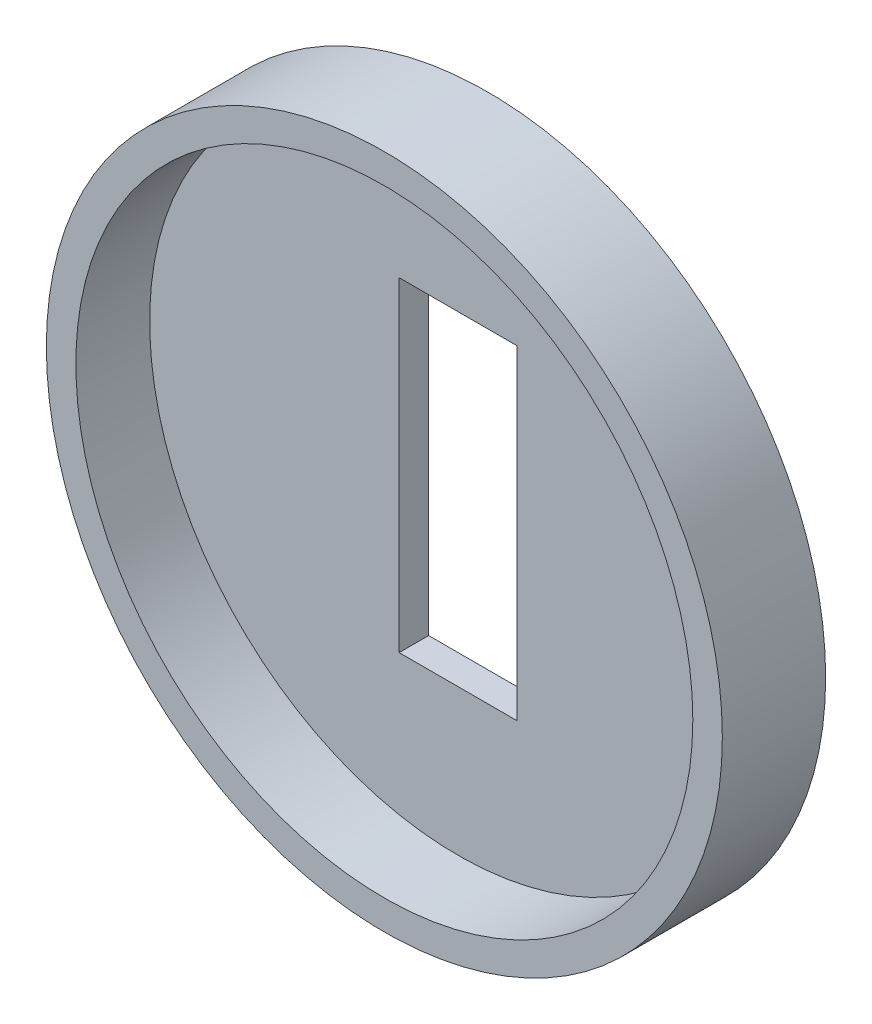
ISO-10303-21;
HEADER;
FILE_DESCRIPTION(('STEP AP214'),'2;1');
FILE_NAME('part.step','',(''),(''),'','','');
FILE_SCHEMA(('AUTOMOTIVE_DESIGN { 1 0 10303 214 1 1 1 1 }'));
ENDSEC;
DATA;
#1=APPLICATION_CONTEXT('core data for automotive mechanical design processes');
#2=APPLICATION_PROTOCOL_DEFINITION('international standard','automotive_design',2000,#1);
#3=PRODUCT_CONTEXT('',#1,'mechanical');
#4=PRODUCT('Part','Part','',(#3));
#5=PRODUCT_RELATED_PRODUCT_CATEGORY('part','',(#4));
#6=PRODUCT_DEFINITION_FORMATION('','',#4);
#7=PRODUCT_DEFINITION_CONTEXT('part definition',#1,'design');
#8=PRODUCT_DEFINITION('design','',#6,#7);
#9=PRODUCT_DEFINITION_SHAPE('','',#8);
#10=(LENGTH_UNIT() NAMED_UNIT(*) SI_UNIT(.MILLI.,.METRE.));
#11=(NAMED_UNIT(*) PLANE_ANGLE_UNIT() SI_UNIT($,.RADIAN.));
#12=(NAMED_UNIT(*) SI_UNIT($,.STERADIAN.) SOLID_ANGLE_UNIT());
#13=UNCERTAINTY_MEASURE_WITH_UNIT(LENGTH_MEASURE(1.E-05),#10,'distance_accuracy_value','');
#14=(GEOMETRIC_REPRESENTATION_CONTEXT(3) GLOBAL_UNCERTAINTY_ASSIGNED_CONTEXT((#13)) GLOBAL_UNIT_ASSIGNED_CONTEXT((#10,
#11,#12)) REPRESENTATION_CONTEXT('',''));
#15=CARTESIAN_POINT('',(0.,0.,0.));
#16=DIRECTION('',(0.,0.,1.));
#17=DIRECTION('',(1.,0.,0.));
#18=AXIS2_PLACEMENT_3D('',#15,#16,#17);
#19=CARTESIAN_POINT('',(0.,0.,0.));
#20=DIRECTION('',(0.,0.,-1.));
#21=DIRECTION('',(-1.,0.,0.));
#22=AXIS2_PLACEMENT_3D('',#19,#20,#21);
#23=PLANE('',#22);
#24=CARTESIAN_POINT('',(0.,0.,0.));
#25=DIRECTION('',(0.,0.,1.));
#26=DIRECTION('',(1.,0.,0.));
#27=AXIS2_PLACEMENT_3D('',#24,#25,#26);
#28=CIRCLE('',#27,22.902);
#29=CARTESIAN_POINT('',(22.902,0.,0.));
#30=VERTEX_POINT('',#29);
#31=EDGE_CURVE('E124',#30,#30,#28,.T.);
#32=ORIENTED_EDGE('',*,*,#31,.F.);
#33=EDGE_LOOP('',(#32));
#34=FACE_BOUND('',#33,.T.);
#35=DIRECTION('',(1.,0.,0.));
#36=VECTOR('',#35,1.);
#37=CARTESIAN_POINT('',(0.,11.,0.));
#38=LINE('',#37,#36);
#39=CARTESIAN_POINT('',(-4.,11.,0.));
#40=VERTEX_POINT('',#39);
#41=CARTESIAN_POINT('',(4.,11.,0.));
#42=VERTEX_POINT('',#41);
#43=EDGE_CURVE('E92',#40,#42,#38,.T.);
#44=ORIENTED_EDGE('',*,*,#43,.F.);
#45=DIRECTION('',(0.,-1.,0.));
#46=VECTOR('',#45,1.);
#47=CARTESIAN_POINT('',(-4.,0.,0.));
#48=LINE('',#47,#46);
#49=CARTESIAN_POINT('',(-4.,-11.,0.));
#50=VERTEX_POINT('',#49);
#51=EDGE_CURVE('E53',#40,#50,#48,.T.);
#52=ORIENTED_EDGE('',*,*,#51,.T.);
#53=DIRECTION('',(1.,0.,0.));
#54=VECTOR('',#53,1.);
#55=CARTESIAN_POINT('',(0.,-11.,0.));
#56=LINE('',#55,#54);
#57=CARTESIAN_POINT('',(4.,-11.,0.));
#58=VERTEX_POINT('',#57);
#59=EDGE_CURVE('E98',#50,#58,#56,.T.);
#60=ORIENTED_EDGE('',*,*,#59,.T.);
#61=DIRECTION('',(0.,-1.,0.));
#62=VECTOR('',#61,1.);
#63=CARTESIAN_POINT('',(4.,0.,0.));
#64=LINE('',#63,#62);
#65=EDGE_CURVE('E82',#42,#58,#64,.T.);
#66=ORIENTED_EDGE('',*,*,#65,.F.);
#67=EDGE_LOOP('',(#44,#52,#60,#66));
#68=FACE_BOUND('',#67,.T.);
#69=ADVANCED_FACE('F38',(#34,#68),#23,.T.);
#70=CARTESIAN_POINT('',(20.902,0.,2.));
#71=DIRECTION('',(0.,0.,1.));
#72=DIRECTION('',(1.,0.,0.));
#73=AXIS2_PLACEMENT_3D('',#70,#71,#72);
#74=PLANE('',#73);
#75=CARTESIAN_POINT('',(0.,0.,2.));
#76=DIRECTION('',(0.,0.,1.));
#77=DIRECTION('',(1.,0.,0.));
#78=AXIS2_PLACEMENT_3D('',#75,#76,#77);
#79=CIRCLE('',#78,20.902);
#80=CARTESIAN_POINT('',(20.902,0.,2.));
#81=VERTEX_POINT('',#80);
#82=EDGE_CURVE('E108',#81,#81,#79,.T.);
#83=ORIENTED_EDGE('',*,*,#82,.T.);
#84=EDGE_LOOP('',(#83));
#85=FACE_BOUND('',#84,.T.);
#86=DIRECTION('',(-1.,0.,0.));
#87=VECTOR('',#86,1.);
#88=CARTESIAN_POINT('',(20.902,-11.,2.));
#89=LINE('',#88,#87);
#90=CARTESIAN_POINT('',(4.,-11.,2.));
#91=VERTEX_POINT('',#90);
#92=CARTESIAN_POINT('',(-4.,-11.,2.));
#93=VERTEX_POINT('',#92);
#94=EDGE_CURVE('E46',#91,#93,#89,.T.);
#95=ORIENTED_EDGE('',*,*,#94,.T.);
#96=DIRECTION('',(0.,1.,0.));
#97=VECTOR('',#96,1.);
#98=CARTESIAN_POINT('',(-4.,0.,2.));
#99=LINE('',#98,#97);
#100=CARTESIAN_POINT('',(-4.,11.,2.));
#101=VERTEX_POINT('',#100);
#102=EDGE_CURVE('E11',#93,#101,#99,.T.);
#103=ORIENTED_EDGE('',*,*,#102,.T.);
#104=DIRECTION('',(-1.,0.,0.));
#105=VECTOR('',#104,1.);
#106=CARTESIAN_POINT('',(20.902,11.,2.));
#107=LINE('',#106,#105);
#108=CARTESIAN_POINT('',(4.,11.,2.));
#109=VERTEX_POINT('',#108);
#110=EDGE_CURVE('E128',#109,#101,#107,.T.);
#111=ORIENTED_EDGE('',*,*,#110,.F.);
#112=DIRECTION('',(0.,1.,0.));
#113=VECTOR('',#112,1.);
#114=CARTESIAN_POINT('',(4.,0.,2.));
#115=LINE('',#114,#113);
#116=EDGE_CURVE('E85',#91,#109,#115,.T.);
#117=ORIENTED_EDGE('',*,*,#116,.F.);
#118=EDGE_LOOP('',(#95,#103,#111,#117));
#119=FACE_BOUND('',#118,.T.);
#120=ADVANCED_FACE('F135',(#85,#119),#74,.T.);
#121=CARTESIAN_POINT('',(0.,0.,2.));
#122=DIRECTION('',(0.,0.,1.));
#123=DIRECTION('',(1.,0.,0.));
#124=AXIS2_PLACEMENT_3D('',#121,#122,#123);
#125=CYLINDRICAL_SURFACE('',#124,22.902);
#126=ORIENTED_EDGE('',*,*,#31,.T.);
#127=EDGE_LOOP('',(#126));
#128=FACE_BOUND('',#127,.T.);
#129=CARTESIAN_POINT('',(0.,0.,7.));
#130=DIRECTION('',(0.,0.,1.));
#131=DIRECTION('',(1.,0.,0.));
#132=AXIS2_PLACEMENT_3D('',#129,#130,#131);
#133=CIRCLE('',#132,22.902);
#134=CARTESIAN_POINT('',(22.902,0.,7.));
#135=VERTEX_POINT('',#134);
#136=EDGE_CURVE('E120',#135,#135,#133,.T.);
#137=ORIENTED_EDGE('',*,*,#136,.F.);
#138=EDGE_LOOP('',(#137));
#139=FACE_BOUND('',#138,.T.);
#140=ADVANCED_FACE('F160',(#128,#139),#125,.T.);
#141=CARTESIAN_POINT('',(22.902,0.,7.));
#142=DIRECTION('',(0.,0.,1.));
#143=DIRECTION('',(1.,0.,0.));
#144=AXIS2_PLACEMENT_3D('',#141,#142,#143);
#145=PLANE('',#144);
#146=ORIENTED_EDGE('',*,*,#136,.T.);
#147=EDGE_LOOP('',(#146));
#148=FACE_BOUND('',#147,.T.);
#149=CARTESIAN_POINT('',(0.,0.,7.));
#150=DIRECTION('',(0.,0.,1.));
#151=DIRECTION('',(1.,0.,0.));
#152=AXIS2_PLACEMENT_3D('',#149,#150,#151);
#153=CIRCLE('',#152,20.902);
#154=CARTESIAN_POINT('',(20.902,0.,7.));
#155=VERTEX_POINT('',#154);
#156=EDGE_CURVE('E116',#155,#155,#153,.T.);
#157=ORIENTED_EDGE('',*,*,#156,.F.);
#158=EDGE_LOOP('',(#157));
#159=FACE_BOUND('',#158,.T.);
#160=ADVANCED_FACE('F149',(#148,#159),#145,.T.);
#161=CARTESIAN_POINT('',(0.,0.,2.));
#162=DIRECTION('',(0.,0.,1.));
#163=DIRECTION('',(1.,0.,0.));
#164=AXIS2_PLACEMENT_3D('',#161,#162,#163);
#165=CYLINDRICAL_SURFACE('',#164,20.902);
#166=ORIENTED_EDGE('',*,*,#156,.T.);
#167=EDGE_LOOP('',(#166));
#168=FACE_BOUND('',#167,.T.);
#169=ORIENTED_EDGE('',*,*,#82,.F.);
#170=EDGE_LOOP('',(#169));
#171=FACE_BOUND('',#170,.T.);
#172=ADVANCED_FACE('F141',(#168,#171),#165,.F.);
#173=CARTESIAN_POINT('',(-4.,0.,10.));
#174=DIRECTION('',(1.,0.,0.));
#175=DIRECTION('',(0.,0.,-1.));
#176=AXIS2_PLACEMENT_3D('',#173,#174,#175);
#177=PLANE('',#176);
#178=DIRECTION('',(0.,0.,-1.));
#179=VECTOR('',#178,1.);
#180=CARTESIAN_POINT('',(-4.,-11.,10.));
#181=LINE('',#180,#179);
#182=EDGE_CURVE('E105',#93,#50,#181,.T.);
#183=ORIENTED_EDGE('',*,*,#182,.T.);
#184=ORIENTED_EDGE('',*,*,#51,.F.);
#185=DIRECTION('',(0.,0.,-1.));
#186=VECTOR('',#185,1.);
#187=CARTESIAN_POINT('',(-4.,11.,10.));
#188=LINE('',#187,#186);
#189=EDGE_CURVE('E89',#101,#40,#188,.T.);
#190=ORIENTED_EDGE('',*,*,#189,.F.);
#191=ORIENTED_EDGE('',*,*,#102,.F.);
#192=EDGE_LOOP('',(#183,#184,#190,#191));
#193=FACE_BOUND('',#192,.T.);
#194=ADVANCED_FACE('F139',(#193),#177,.T.);
#195=CARTESIAN_POINT('',(0.,-11.,10.));
#196=DIRECTION('',(0.,1.,0.));
#197=DIRECTION('',(0.,0.,1.));
#198=AXIS2_PLACEMENT_3D('',#195,#196,#197);
#199=PLANE('',#198);
#200=DIRECTION('',(0.,0.,-1.));
#201=VECTOR('',#200,1.);
#202=CARTESIAN_POINT('',(4.,-11.,10.));
#203=LINE('',#202,#201);
#204=EDGE_CURVE('E88',#91,#58,#203,.T.);
#205=ORIENTED_EDGE('',*,*,#204,.T.);
#206=ORIENTED_EDGE('',*,*,#59,.F.);
#207=ORIENTED_EDGE('',*,*,#182,.F.);
#208=ORIENTED_EDGE('',*,*,#94,.F.);
#209=EDGE_LOOP('',(#205,#206,#207,#208));
#210=FACE_BOUND('',#209,.T.);
#211=ADVANCED_FACE('F138',(#210),#199,.T.);
#212=CARTESIAN_POINT('',(4.,0.,10.));
#213=DIRECTION('',(1.,0.,0.));
#214=DIRECTION('',(0.,1.,0.));
#215=AXIS2_PLACEMENT_3D('',#212,#213,#214);
#216=PLANE('',#215);
#217=ORIENTED_EDGE('',*,*,#116,.T.);
#218=DIRECTION('',(0.,0.,-1.));
#219=VECTOR('',#218,1.);
#220=CARTESIAN_POINT('',(4.,11.,10.));
#221=LINE('',#220,#219);
#222=EDGE_CURVE('E61',#109,#42,#221,.T.);
#223=ORIENTED_EDGE('',*,*,#222,.T.);
#224=ORIENTED_EDGE('',*,*,#65,.T.);
#225=ORIENTED_EDGE('',*,*,#204,.F.);
#226=EDGE_LOOP('',(#217,#223,#224,#225));
#227=FACE_BOUND('',#226,.T.);
#228=ADVANCED_FACE('F79',(#227),#216,.F.);
#229=CARTESIAN_POINT('',(0.,11.,10.));
#230=DIRECTION('',(0.,1.,0.));
#231=DIRECTION('',(0.,0.,1.));
#232=AXIS2_PLACEMENT_3D('',#229,#230,#231);
#233=PLANE('',#232);
#234=ORIENTED_EDGE('',*,*,#110,.T.);
#235=ORIENTED_EDGE('',*,*,#189,.T.);
#236=ORIENTED_EDGE('',*,*,#43,.T.);
#237=ORIENTED_EDGE('',*,*,#222,.F.);
#238=EDGE_LOOP('',(#234,#235,#236,#237));
#239=FACE_BOUND('',#238,.T.);
#240=ADVANCED_FACE('F93',(#239),#233,.F.);
#241=CLOSED_SHELL('',(#69,#120,#140,#160,#172,#194,#211,#228,#240));
#242=MANIFOLD_SOLID_BREP('B2',#241);
#243=ADVANCED_BREP_SHAPE_REPRESENTATION('',(#18,#242),#14);
#244=SHAPE_DEFINITION_REPRESENTATION(#9,#243);
ENDSEC;
END-ISO-10303-21;
